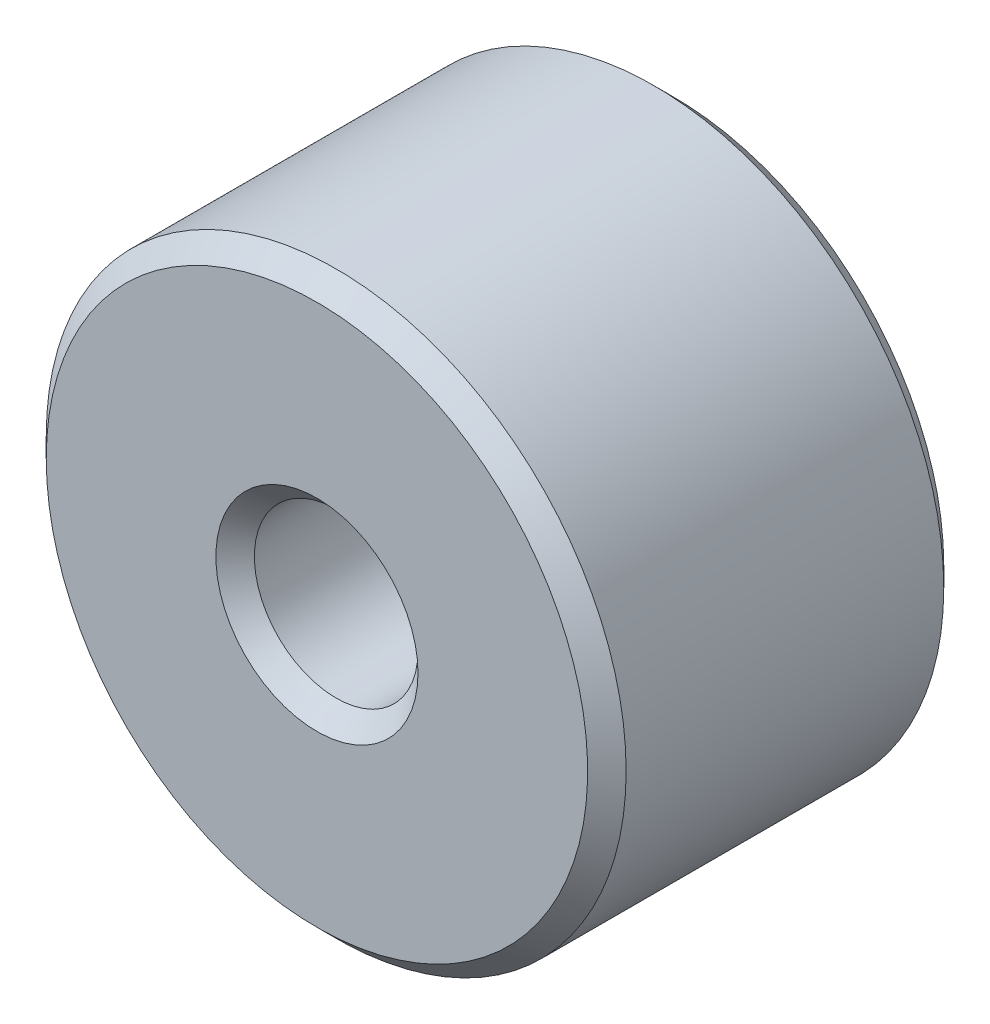
ISO-10303-21;
HEADER;
FILE_DESCRIPTION(('STEP AP214'),'2;1');
FILE_NAME('part.step','',(''),(''),'','','');
FILE_SCHEMA(('AUTOMOTIVE_DESIGN { 1 0 10303 214 1 1 1 1 }'));
ENDSEC;
DATA;
#1=APPLICATION_CONTEXT('core data for automotive mechanical design processes');
#2=APPLICATION_PROTOCOL_DEFINITION('international standard','automotive_design',2000,#1);
#3=PRODUCT_CONTEXT('',#1,'mechanical');
#4=PRODUCT('Part','Part','',(#3));
#5=PRODUCT_RELATED_PRODUCT_CATEGORY('part','',(#4));
#6=PRODUCT_DEFINITION_FORMATION('','',#4);
#7=PRODUCT_DEFINITION_CONTEXT('part definition',#1,'design');
#8=PRODUCT_DEFINITION('design','',#6,#7);
#9=PRODUCT_DEFINITION_SHAPE('','',#8);
#10=(LENGTH_UNIT() NAMED_UNIT(*) SI_UNIT(.MILLI.,.METRE.));
#11=(NAMED_UNIT(*) PLANE_ANGLE_UNIT() SI_UNIT($,.RADIAN.));
#12=(NAMED_UNIT(*) SI_UNIT($,.STERADIAN.) SOLID_ANGLE_UNIT());
#13=UNCERTAINTY_MEASURE_WITH_UNIT(LENGTH_MEASURE(1.E-05),#10,'distance_accuracy_value','');
#14=(GEOMETRIC_REPRESENTATION_CONTEXT(3) GLOBAL_UNCERTAINTY_ASSIGNED_CONTEXT((#13)) GLOBAL_UNIT_ASSIGNED_CONTEXT((#10,
#11,#12)) REPRESENTATION_CONTEXT('',''));
#15=CARTESIAN_POINT('',(0.,0.,0.));
#16=DIRECTION('',(0.,0.,1.));
#17=DIRECTION('',(1.,0.,0.));
#18=AXIS2_PLACEMENT_3D('',#15,#16,#17);
#19=CARTESIAN_POINT('',(0.,0.,7.4));
#20=DIRECTION('',(0.,0.,1.));
#21=DIRECTION('',(1.,0.,0.));
#22=AXIS2_PLACEMENT_3D('',#19,#20,#21);
#23=PLANE('',#22);
#24=CARTESIAN_POINT('',(0.,0.,7.4));
#25=DIRECTION('',(0.,0.,1.));
#26=DIRECTION('',(1.,0.,0.));
#27=AXIS2_PLACEMENT_3D('',#24,#25,#26);
#28=CIRCLE('',#27,5.625);
#29=CARTESIAN_POINT('',(-5.625,0.,7.4));
#30=VERTEX_POINT('',#29);
#31=EDGE_CURVE('E10',#30,#30,#28,.T.);
#32=ORIENTED_EDGE('',*,*,#31,.T.);
#33=EDGE_LOOP('',(#32));
#34=FACE_BOUND('',#33,.T.);
#35=CARTESIAN_POINT('',(0.,0.,7.4));
#36=DIRECTION('',(0.,0.,1.));
#37=DIRECTION('',(1.,0.,0.));
#38=AXIS2_PLACEMENT_3D('',#35,#36,#37);
#39=CIRCLE('',#38,2.1);
#40=CARTESIAN_POINT('',(2.1,0.,7.4));
#41=VERTEX_POINT('',#40);
#42=EDGE_CURVE('E41',#41,#41,#39,.F.);
#43=ORIENTED_EDGE('',*,*,#42,.T.);
#44=EDGE_LOOP('',(#43));
#45=FACE_BOUND('',#44,.T.);
#46=ADVANCED_FACE('F34',(#34,#45),#23,.T.);
#47=CARTESIAN_POINT('',(0.,0.,0.));
#48=DIRECTION('',(0.,0.,1.));
#49=DIRECTION('',(1.,0.,0.));
#50=AXIS2_PLACEMENT_3D('',#47,#48,#49);
#51=PLANE('',#50);
#52=CARTESIAN_POINT('',(0.,0.,0.));
#53=DIRECTION('',(0.,0.,1.));
#54=DIRECTION('',(1.,0.,0.));
#55=AXIS2_PLACEMENT_3D('',#52,#53,#54);
#56=CIRCLE('',#55,2.1);
#57=CARTESIAN_POINT('',(2.1,0.,0.));
#58=VERTEX_POINT('',#57);
#59=EDGE_CURVE('E60',#58,#58,#56,.T.);
#60=ORIENTED_EDGE('',*,*,#59,.T.);
#61=EDGE_LOOP('',(#60));
#62=FACE_BOUND('',#61,.T.);
#63=CARTESIAN_POINT('',(0.,0.,0.));
#64=DIRECTION('',(0.,0.,1.));
#65=DIRECTION('',(1.,0.,0.));
#66=AXIS2_PLACEMENT_3D('',#63,#64,#65);
#67=CIRCLE('',#66,5.625);
#68=CARTESIAN_POINT('',(5.625,0.,0.));
#69=VERTEX_POINT('',#68);
#70=EDGE_CURVE('E63',#69,#69,#67,.F.);
#71=ORIENTED_EDGE('',*,*,#70,.T.);
#72=EDGE_LOOP('',(#71));
#73=FACE_BOUND('',#72,.T.);
#74=ADVANCED_FACE('F67',(#62,#73),#51,.F.);
#75=CARTESIAN_POINT('',(0.,0.,7.4));
#76=DIRECTION('',(0.,0.,-1.));
#77=DIRECTION('',(-1.,0.,0.));
#78=AXIS2_PLACEMENT_3D('',#75,#76,#77);
#79=CYLINDRICAL_SURFACE('',#78,6.025);
#80=CARTESIAN_POINT('',(0.,0.,0.4));
#81=DIRECTION('',(0.,0.,1.));
#82=DIRECTION('',(1.,0.,0.));
#83=AXIS2_PLACEMENT_3D('',#80,#81,#82);
#84=CIRCLE('',#83,6.025);
#85=CARTESIAN_POINT('',(6.025,0.,0.4));
#86=VERTEX_POINT('',#85);
#87=EDGE_CURVE('E45',#86,#86,#84,.T.);
#88=ORIENTED_EDGE('',*,*,#87,.T.);
#89=EDGE_LOOP('',(#88));
#90=FACE_BOUND('',#89,.T.);
#91=CARTESIAN_POINT('',(0.,0.,7.));
#92=DIRECTION('',(0.,0.,1.));
#93=DIRECTION('',(1.,0.,0.));
#94=AXIS2_PLACEMENT_3D('',#91,#92,#93);
#95=CIRCLE('',#94,6.025);
#96=CARTESIAN_POINT('',(-6.025,0.,7.));
#97=VERTEX_POINT('',#96);
#98=EDGE_CURVE('E49',#97,#97,#95,.F.);
#99=ORIENTED_EDGE('',*,*,#98,.T.);
#100=EDGE_LOOP('',(#99));
#101=FACE_BOUND('',#100,.T.);
#102=ADVANCED_FACE('F77',(#90,#101),#79,.T.);
#103=CARTESIAN_POINT('',(0.,0.,7.4));
#104=DIRECTION('',(0.,0.,-1.));
#105=DIRECTION('',(-1.,0.,0.));
#106=AXIS2_PLACEMENT_3D('',#103,#104,#105);
#107=CYLINDRICAL_SURFACE('',#106,1.7);
#108=CARTESIAN_POINT('',(0.,0.,0.400000000000005));
#109=DIRECTION('',(0.,0.,1.));
#110=DIRECTION('',(1.,0.,0.));
#111=AXIS2_PLACEMENT_3D('',#108,#109,#110);
#112=CIRCLE('',#111,1.7);
#113=CARTESIAN_POINT('',(1.7,0.,0.400000000000005));
#114=VERTEX_POINT('',#113);
#115=EDGE_CURVE('E54',#114,#114,#112,.F.);
#116=ORIENTED_EDGE('',*,*,#115,.T.);
#117=EDGE_LOOP('',(#116));
#118=FACE_BOUND('',#117,.T.);
#119=CARTESIAN_POINT('',(0.,0.,7.));
#120=DIRECTION('',(0.,0.,1.));
#121=DIRECTION('',(1.,0.,0.));
#122=AXIS2_PLACEMENT_3D('',#119,#120,#121);
#123=CIRCLE('',#122,1.7);
#124=CARTESIAN_POINT('',(1.7,0.,7.));
#125=VERTEX_POINT('',#124);
#126=EDGE_CURVE('E57',#125,#125,#123,.T.);
#127=ORIENTED_EDGE('',*,*,#126,.T.);
#128=EDGE_LOOP('',(#127));
#129=FACE_BOUND('',#128,.T.);
#130=ADVANCED_FACE('F80',(#118,#129),#107,.F.);
#131=CARTESIAN_POINT('',(0.,0.,0.));
#132=DIRECTION('',(0.,0.,-1.));
#133=DIRECTION('',(-1.,0.,0.));
#134=AXIS2_PLACEMENT_3D('',#131,#132,#133);
#135=CONICAL_SURFACE('',#134,2.1,0.785398163397444);
#136=ORIENTED_EDGE('',*,*,#115,.F.);
#137=EDGE_LOOP('',(#136));
#138=FACE_BOUND('',#137,.T.);
#139=ORIENTED_EDGE('',*,*,#59,.F.);
#140=EDGE_LOOP('',(#139));
#141=FACE_BOUND('',#140,.T.);
#142=ADVANCED_FACE('F73',(#138,#141),#135,.F.);
#143=CARTESIAN_POINT('',(0.,0.,0.4));
#144=DIRECTION('',(0.,0.,1.));
#145=DIRECTION('',(1.,0.,0.));
#146=AXIS2_PLACEMENT_3D('',#143,#144,#145);
#147=CONICAL_SURFACE('',#146,6.025,0.78539816339745);
#148=ORIENTED_EDGE('',*,*,#70,.F.);
#149=EDGE_LOOP('',(#148));
#150=FACE_BOUND('',#149,.T.);
#151=ORIENTED_EDGE('',*,*,#87,.F.);
#152=EDGE_LOOP('',(#151));
#153=FACE_BOUND('',#152,.T.);
#154=ADVANCED_FACE('F69',(#150,#153),#147,.T.);
#155=CARTESIAN_POINT('',(0.,0.,7.4));
#156=DIRECTION('',(0.,0.,-1.));
#157=DIRECTION('',(-1.,0.,0.));
#158=AXIS2_PLACEMENT_3D('',#155,#156,#157);
#159=CONICAL_SURFACE('',#158,5.625,0.785398163397446);
#160=CARTESIAN_POINT('',(-6.025,0.,7.));
#161=CARTESIAN_POINT('',(-6.02083333333333,0.,7.00416666666667));
#162=CARTESIAN_POINT('',(-6.01666666666667,0.,7.00833333333333));
#163=CARTESIAN_POINT('',(-6.00833333333333,0.,7.01666666666667));
#164=CARTESIAN_POINT('',(-6.00416666666667,0.,7.02083333333333));
#165=CARTESIAN_POINT('',(-5.99583333333333,0.,7.02916666666667));
#166=CARTESIAN_POINT('',(-5.99166666666667,0.,7.03333333333333));
#167=CARTESIAN_POINT('',(-5.98333333333333,0.,7.04166666666667));
#168=CARTESIAN_POINT('',(-5.97916666666667,0.,7.04583333333333));
#169=CARTESIAN_POINT('',(-5.97083333333333,0.,7.05416666666667));
#170=CARTESIAN_POINT('',(-5.96666666666667,0.,7.05833333333333));
#171=CARTESIAN_POINT('',(-5.95833333333333,0.,7.06666666666667));
#172=CARTESIAN_POINT('',(-5.95416666666667,0.,7.07083333333333));
#173=CARTESIAN_POINT('',(-5.94583333333334,0.,7.07916666666667));
#174=CARTESIAN_POINT('',(-5.94166666666667,0.,7.08333333333333));
#175=CARTESIAN_POINT('',(-5.93333333333333,0.,7.09166666666667));
#176=CARTESIAN_POINT('',(-5.92916666666667,0.,7.09583333333333));
#177=CARTESIAN_POINT('',(-5.92083333333333,0.,7.10416666666667));
#178=CARTESIAN_POINT('',(-5.91666666666667,0.,7.10833333333333));
#179=CARTESIAN_POINT('',(-5.90833333333333,0.,7.11666666666667));
#180=CARTESIAN_POINT('',(-5.90416666666667,0.,7.12083333333333));
#181=CARTESIAN_POINT('',(-5.89583333333333,0.,7.12916666666667));
#182=CARTESIAN_POINT('',(-5.89166666666667,0.,7.13333333333333));
#183=CARTESIAN_POINT('',(-5.88333333333333,0.,7.14166666666667));
#184=CARTESIAN_POINT('',(-5.87916666666667,0.,7.14583333333333));
#185=CARTESIAN_POINT('',(-5.87083333333333,0.,7.15416666666667));
#186=CARTESIAN_POINT('',(-5.86666666666667,0.,7.15833333333333));
#187=CARTESIAN_POINT('',(-5.85833333333334,0.,7.16666666666667));
#188=CARTESIAN_POINT('',(-5.85416666666667,0.,7.17083333333333));
#189=CARTESIAN_POINT('',(-5.84583333333333,0.,7.17916666666667));
#190=CARTESIAN_POINT('',(-5.84166666666667,0.,7.18333333333333));
#191=CARTESIAN_POINT('',(-5.83333333333334,0.,7.19166666666667));
#192=CARTESIAN_POINT('',(-5.82916666666667,0.,7.19583333333333));
#193=CARTESIAN_POINT('',(-5.82083333333333,0.,7.20416666666667));
#194=CARTESIAN_POINT('',(-5.81666666666667,0.,7.20833333333333));
#195=CARTESIAN_POINT('',(-5.80833333333334,0.,7.21666666666667));
#196=CARTESIAN_POINT('',(-5.80416666666667,0.,7.22083333333333));
#197=CARTESIAN_POINT('',(-5.79583333333334,0.,7.22916666666667));
#198=CARTESIAN_POINT('',(-5.79166666666667,0.,7.23333333333333));
#199=CARTESIAN_POINT('',(-5.78333333333334,0.,7.24166666666667));
#200=CARTESIAN_POINT('',(-5.77916666666667,0.,7.24583333333333));
#201=CARTESIAN_POINT('',(-5.77083333333334,0.,7.25416666666667));
#202=CARTESIAN_POINT('',(-5.76666666666667,0.,7.25833333333333));
#203=CARTESIAN_POINT('',(-5.75833333333333,0.,7.26666666666667));
#204=CARTESIAN_POINT('',(-5.75416666666667,0.,7.27083333333333));
#205=CARTESIAN_POINT('',(-5.74583333333334,0.,7.27916666666667));
#206=CARTESIAN_POINT('',(-5.74166666666667,0.,7.28333333333333));
#207=CARTESIAN_POINT('',(-5.73333333333334,0.,7.29166666666667));
#208=CARTESIAN_POINT('',(-5.72916666666667,0.,7.29583333333333));
#209=CARTESIAN_POINT('',(-5.72083333333334,0.,7.30416666666667));
#210=CARTESIAN_POINT('',(-5.71666666666667,0.,7.30833333333333));
#211=CARTESIAN_POINT('',(-5.70833333333333,0.,7.31666666666667));
#212=CARTESIAN_POINT('',(-5.70416666666667,0.,7.32083333333333));
#213=CARTESIAN_POINT('',(-5.69583333333334,0.,7.32916666666667));
#214=CARTESIAN_POINT('',(-5.69166666666667,0.,7.33333333333333));
#215=CARTESIAN_POINT('',(-5.68333333333334,0.,7.34166666666667));
#216=CARTESIAN_POINT('',(-5.67916666666667,0.,7.34583333333333));
#217=CARTESIAN_POINT('',(-5.67083333333334,0.,7.35416666666667));
#218=CARTESIAN_POINT('',(-5.66666666666667,0.,7.35833333333333));
#219=CARTESIAN_POINT('',(-5.65833333333334,0.,7.36666666666667));
#220=CARTESIAN_POINT('',(-5.65416666666667,0.,7.37083333333333));
#221=CARTESIAN_POINT('',(-5.64583333333333,0.,7.37916666666667));
#222=CARTESIAN_POINT('',(-5.64166666666667,0.,7.38333333333333));
#223=CARTESIAN_POINT('',(-5.63333333333334,0.,7.39166666666667));
#224=CARTESIAN_POINT('',(-5.62916666666667,0.,7.39583333333333));
#225=CARTESIAN_POINT('',(-5.625,0.,7.4));
#226=B_SPLINE_CURVE_WITH_KNOTS('',3,(#160,#161,#162,#163,#164,#165,#166,#167,#168,#169,#170,
#171,#172,#173,#174,#175,#176,#177,#178,#179,#180,#181,#182,#183,#184,#185,#186,#187,#188,#189,
#190,#191,#192,#193,#194,#195,#196,#197,#198,#199,#200,#201,#202,#203,#204,#205,#206,#207,#208,
#209,#210,#211,#212,#213,#214,#215,#216,#217,#218,#219,#220,#221,#222,#223,#224,#225),
.UNSPECIFIED.,.F.,.F.,(4,2,2,2,2,2,2,2,2,2,2,2,2,2,2,2,2,2,2,2,2,2,2,2,2,2,2,2,2,2,2,2,4),(0.,
0.0176776695296642,0.0353553390593278,0.0530330085889914,0.0707106781186549,0.0883883476483185,
0.106066017177982,0.123743686707646,0.141421356237309,0.159099025766973,0.176776695296636,
0.194454364826301,0.212132034355964,0.229809703885628,0.247487373415291,0.265165042944955,
0.282842712474618,0.300520382004282,0.318198051533946,0.335875721063609,0.353553390593273,
0.371231060122936,0.3889087296526,0.406586399182264,0.424264068711928,0.441941738241591,
0.459619407771255,0.477297077300919,0.494974746830582,0.512652416360246,0.530330085889909,
0.548007755419573,0.565685424949237),.UNSPECIFIED.);
#227=EDGE_CURVE('BSEAM72',#97,#30,#226,.T.);
#228=ORIENTED_EDGE('',*,*,#98,.F.);
#229=ORIENTED_EDGE('',*,*,#31,.F.);
#230=ORIENTED_EDGE('',*,*,#227,.T.);
#231=ORIENTED_EDGE('',*,*,#227,.F.);
#232=EDGE_LOOP('',(#228,#230,#229,#231));
#233=FACE_BOUND('',#232,.T.);
#234=ADVANCED_FACE('F72',(#233),#159,.T.);
#235=CARTESIAN_POINT('',(0.,0.,7.));
#236=DIRECTION('',(0.,0.,1.));
#237=DIRECTION('',(1.,0.,0.));
#238=AXIS2_PLACEMENT_3D('',#235,#236,#237);
#239=CONICAL_SURFACE('',#238,1.7,0.785398163397452);
#240=CARTESIAN_POINT('',(2.1,0.,7.4));
#241=CARTESIAN_POINT('',(2.09583333333333,0.,7.39583333333333));
#242=CARTESIAN_POINT('',(2.09166666666667,0.,7.39166666666667));
#243=CARTESIAN_POINT('',(2.08333333333333,0.,7.38333333333333));
#244=CARTESIAN_POINT('',(2.07916666666667,0.,7.37916666666667));
#245=CARTESIAN_POINT('',(2.07083333333333,0.,7.37083333333333));
#246=CARTESIAN_POINT('',(2.06666666666667,0.,7.36666666666667));
#247=CARTESIAN_POINT('',(2.05833333333333,0.,7.35833333333333));
#248=CARTESIAN_POINT('',(2.05416666666667,0.,7.35416666666667));
#249=CARTESIAN_POINT('',(2.04583333333333,0.,7.34583333333333));
#250=CARTESIAN_POINT('',(2.04166666666667,0.,7.34166666666667));
#251=CARTESIAN_POINT('',(2.03333333333333,0.,7.33333333333333));
#252=CARTESIAN_POINT('',(2.02916666666667,0.,7.32916666666667));
#253=CARTESIAN_POINT('',(2.02083333333333,0.,7.32083333333333));
#254=CARTESIAN_POINT('',(2.01666666666667,0.,7.31666666666667));
#255=CARTESIAN_POINT('',(2.00833333333333,0.,7.30833333333333));
#256=CARTESIAN_POINT('',(2.00416666666667,0.,7.30416666666667));
#257=CARTESIAN_POINT('',(1.99583333333333,0.,7.29583333333333));
#258=CARTESIAN_POINT('',(1.99166666666667,0.,7.29166666666667));
#259=CARTESIAN_POINT('',(1.98333333333333,0.,7.28333333333333));
#260=CARTESIAN_POINT('',(1.97916666666667,0.,7.27916666666667));
#261=CARTESIAN_POINT('',(1.97083333333333,0.,7.27083333333333));
#262=CARTESIAN_POINT('',(1.96666666666667,0.,7.26666666666667));
#263=CARTESIAN_POINT('',(1.95833333333333,0.,7.25833333333333));
#264=CARTESIAN_POINT('',(1.95416666666667,0.,7.25416666666667));
#265=CARTESIAN_POINT('',(1.94583333333333,0.,7.24583333333333));
#266=CARTESIAN_POINT('',(1.94166666666667,0.,7.24166666666667));
#267=CARTESIAN_POINT('',(1.93333333333333,0.,7.23333333333333));
#268=CARTESIAN_POINT('',(1.92916666666667,0.,7.22916666666667));
#269=CARTESIAN_POINT('',(1.92083333333333,0.,7.22083333333333));
#270=CARTESIAN_POINT('',(1.91666666666667,0.,7.21666666666667));
#271=CARTESIAN_POINT('',(1.90833333333333,0.,7.20833333333333));
#272=CARTESIAN_POINT('',(1.90416666666667,0.,7.20416666666667));
#273=CARTESIAN_POINT('',(1.89583333333333,0.,7.19583333333333));
#274=CARTESIAN_POINT('',(1.89166666666667,0.,7.19166666666667));
#275=CARTESIAN_POINT('',(1.88333333333333,0.,7.18333333333333));
#276=CARTESIAN_POINT('',(1.87916666666667,0.,7.17916666666667));
#277=CARTESIAN_POINT('',(1.87083333333333,0.,7.17083333333333));
#278=CARTESIAN_POINT('',(1.86666666666667,0.,7.16666666666667));
#279=CARTESIAN_POINT('',(1.85833333333333,0.,7.15833333333333));
#280=CARTESIAN_POINT('',(1.85416666666667,0.,7.15416666666667));
#281=CARTESIAN_POINT('',(1.84583333333333,0.,7.14583333333333));
#282=CARTESIAN_POINT('',(1.84166666666667,0.,7.14166666666667));
#283=CARTESIAN_POINT('',(1.83333333333333,0.,7.13333333333333));
#284=CARTESIAN_POINT('',(1.82916666666667,0.,7.12916666666667));
#285=CARTESIAN_POINT('',(1.82083333333333,0.,7.12083333333333));
#286=CARTESIAN_POINT('',(1.81666666666667,0.,7.11666666666667));
#287=CARTESIAN_POINT('',(1.80833333333333,0.,7.10833333333333));
#288=CARTESIAN_POINT('',(1.80416666666667,0.,7.10416666666667));
#289=CARTESIAN_POINT('',(1.79583333333333,0.,7.09583333333333));
#290=CARTESIAN_POINT('',(1.79166666666667,0.,7.09166666666667));
#291=CARTESIAN_POINT('',(1.78333333333333,0.,7.08333333333333));
#292=CARTESIAN_POINT('',(1.77916666666667,0.,7.07916666666667));
#293=CARTESIAN_POINT('',(1.77083333333333,0.,7.07083333333333));
#294=CARTESIAN_POINT('',(1.76666666666667,0.,7.06666666666667));
#295=CARTESIAN_POINT('',(1.75833333333333,0.,7.05833333333333));
#296=CARTESIAN_POINT('',(1.75416666666667,0.,7.05416666666667));
#297=CARTESIAN_POINT('',(1.74583333333333,0.,7.04583333333333));
#298=CARTESIAN_POINT('',(1.74166666666667,0.,7.04166666666667));
#299=CARTESIAN_POINT('',(1.73333333333333,0.,7.03333333333333));
#300=CARTESIAN_POINT('',(1.72916666666667,0.,7.02916666666667));
#301=CARTESIAN_POINT('',(1.72083333333333,0.,7.02083333333333));
#302=CARTESIAN_POINT('',(1.71666666666667,0.,7.01666666666667));
#303=CARTESIAN_POINT('',(1.70833333333333,0.,7.00833333333334));
#304=CARTESIAN_POINT('',(1.70416666666667,0.,7.00416666666667));
#305=CARTESIAN_POINT('',(1.7,0.,7.));
#306=B_SPLINE_CURVE_WITH_KNOTS('',3,(#240,#241,#242,#243,#244,#245,#246,#247,#248,#249,#250,
#251,#252,#253,#254,#255,#256,#257,#258,#259,#260,#261,#262,#263,#264,#265,#266,#267,#268,#269,
#270,#271,#272,#273,#274,#275,#276,#277,#278,#279,#280,#281,#282,#283,#284,#285,#286,#287,#288,
#289,#290,#291,#292,#293,#294,#295,#296,#297,#298,#299,#300,#301,#302,#303,#304,#305),
.UNSPECIFIED.,.F.,.F.,(4,2,2,2,2,2,2,2,2,2,2,2,2,2,2,2,2,2,2,2,2,2,2,2,2,2,2,2,2,2,2,2,4),(0.,
0.0176776695296633,0.0353553390593275,0.0530330085889907,0.0707106781186546,0.0883883476483179,
0.106066017177982,0.123743686707645,0.141421356237309,0.159099025766973,0.176776695296637,
0.1944543648263,0.212132034355964,0.229809703885627,0.247487373415291,0.265165042944955,
0.282842712474619,0.300520382004283,0.318198051533946,0.33587572106361,0.353553390593273,
0.371231060122937,0.388908729652601,0.406586399182265,0.424264068711928,0.441941738241592,
0.459619407771255,0.477297077300919,0.494974746830583,0.512652416360246,0.53033008588991,
0.548007755419574,0.565685424949237),.UNSPECIFIED.);
#307=EDGE_CURVE('BSEAM36',#41,#125,#306,.T.);
#308=ORIENTED_EDGE('',*,*,#42,.F.);
#309=ORIENTED_EDGE('',*,*,#126,.F.);
#310=ORIENTED_EDGE('',*,*,#307,.T.);
#311=ORIENTED_EDGE('',*,*,#307,.F.);
#312=EDGE_LOOP('',(#308,#310,#309,#311));
#313=FACE_BOUND('',#312,.T.);
#314=ADVANCED_FACE('F36',(#313),#239,.F.);
#315=CLOSED_SHELL('',(#46,#74,#102,#130,#142,#154,#234,#314));
#316=MANIFOLD_SOLID_BREP('B2',#315);
#317=ADVANCED_BREP_SHAPE_REPRESENTATION('',(#18,#316),#14);
#318=SHAPE_DEFINITION_REPRESENTATION(#9,#317);
ENDSEC;
END-ISO-10303-21;
